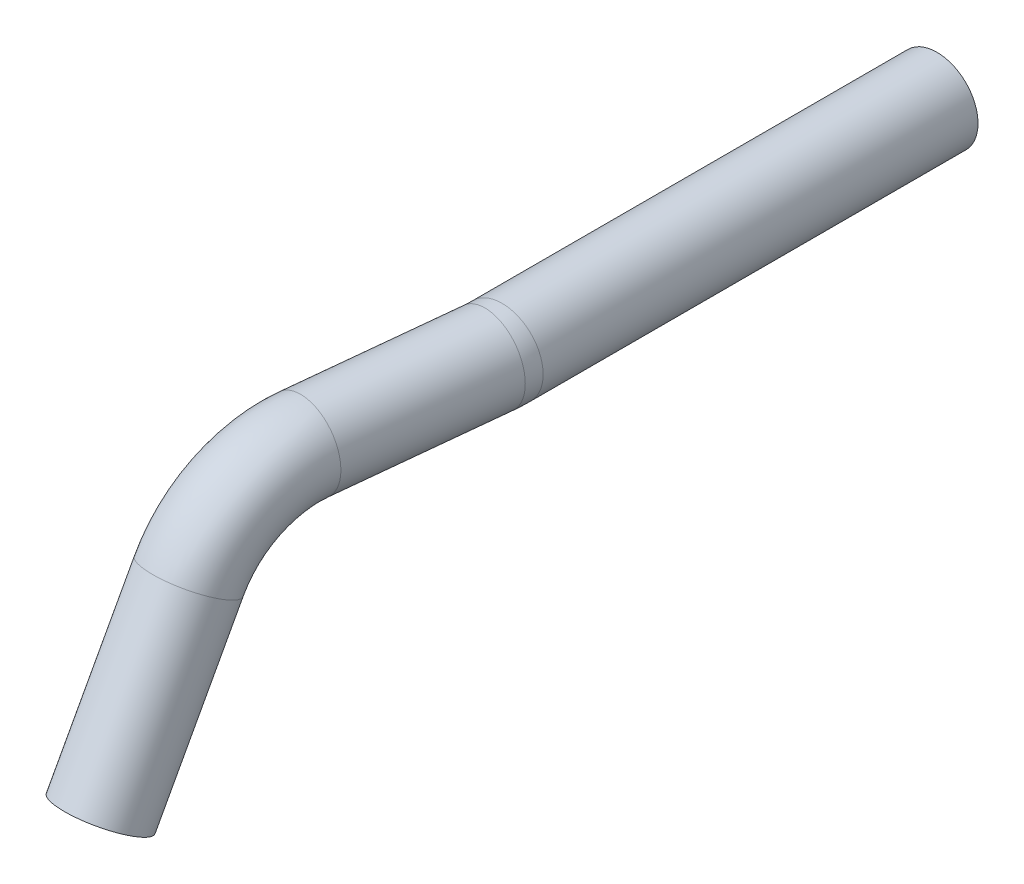
ISO-10303-21;
HEADER;
FILE_DESCRIPTION(('STEP AP214'),'2;1');
FILE_NAME('part.step','',(''),(''),'','','');
FILE_SCHEMA(('AUTOMOTIVE_DESIGN { 1 0 10303 214 1 1 1 1 }'));
ENDSEC;
DATA;
#1=APPLICATION_CONTEXT('core data for automotive mechanical design processes');
#2=APPLICATION_PROTOCOL_DEFINITION('international standard','automotive_design',2000,#1);
#3=PRODUCT_CONTEXT('',#1,'mechanical');
#4=PRODUCT('Part','Part','',(#3));
#5=PRODUCT_RELATED_PRODUCT_CATEGORY('part','',(#4));
#6=PRODUCT_DEFINITION_FORMATION('','',#4);
#7=PRODUCT_DEFINITION_CONTEXT('part definition',#1,'design');
#8=PRODUCT_DEFINITION('design','',#6,#7);
#9=PRODUCT_DEFINITION_SHAPE('','',#8);
#10=(LENGTH_UNIT() NAMED_UNIT(*) SI_UNIT(.MILLI.,.METRE.));
#11=(NAMED_UNIT(*) PLANE_ANGLE_UNIT() SI_UNIT($,.RADIAN.));
#12=(NAMED_UNIT(*) SI_UNIT($,.STERADIAN.) SOLID_ANGLE_UNIT());
#13=UNCERTAINTY_MEASURE_WITH_UNIT(LENGTH_MEASURE(1.E-05),#10,'distance_accuracy_value','');
#14=(GEOMETRIC_REPRESENTATION_CONTEXT(3) GLOBAL_UNCERTAINTY_ASSIGNED_CONTEXT((#13)) GLOBAL_UNIT_ASSIGNED_CONTEXT((#10,
#11,#12)) REPRESENTATION_CONTEXT('',''));
#15=CARTESIAN_POINT('',(0.,0.,0.));
#16=DIRECTION('',(0.,0.,1.));
#17=DIRECTION('',(1.,0.,0.));
#18=AXIS2_PLACEMENT_3D('',#15,#16,#17);
#19=CARTESIAN_POINT('',(-85.5,22.,-33.));
#20=DIRECTION('',(0.,0.,-1.));
#21=DIRECTION('',(0.,-1.,0.));
#22=AXIS2_PLACEMENT_3D('',#19,#20,#21);
#23=PLANE('',#22);
#24=CARTESIAN_POINT('',(-85.5,22.,-33.));
#25=DIRECTION('',(0.,0.,-1.));
#26=DIRECTION('',(0.0616113622510349,0.99810021543008,0.));
#27=AXIS2_PLACEMENT_3D('',#24,#25,#26);
#28=CIRCLE('',#27,4.);
#29=CARTESIAN_POINT('',(-85.2535545509959,25.9924008617203,-33.));
#30=VERTEX_POINT('',#29);
#31=EDGE_CURVE('E10',#30,#30,#28,.T.);
#32=ORIENTED_EDGE('',*,*,#31,.T.);
#33=EDGE_LOOP('',(#32));
#34=FACE_BOUND('',#33,.T.);
#35=ADVANCED_FACE('F15',(#34),#23,.T.);
#36=CARTESIAN_POINT('',(-88.,0.,46.));
#37=DIRECTION('',(0.,0.877895572914117,-0.478852130681064));
#38=DIRECTION('',(-1.,0.,0.));
#39=AXIS2_PLACEMENT_3D('',#36,#37,#38);
#40=PLANE('',#39);
#41=CARTESIAN_POINT('',(-88.,0.,46.));
#42=DIRECTION('',(0.,0.877895572914117,-0.478852130681064));
#43=DIRECTION('',(0.,0.478852130681064,0.877895572914117));
#44=AXIS2_PLACEMENT_3D('',#41,#42,#43);
#45=CIRCLE('',#44,4.);
#46=CARTESIAN_POINT('',(-88.,1.91540852272426,49.5115822916565));
#47=VERTEX_POINT('',#46);
#48=EDGE_CURVE('E37',#47,#47,#45,.T.);
#49=ORIENTED_EDGE('',*,*,#48,.F.);
#50=EDGE_LOOP('',(#49));
#51=FACE_BOUND('',#50,.T.);
#52=ADVANCED_FACE('F17',(#51),#40,.F.);
#53=CARTESIAN_POINT('',(-85.5,22.,9.376686284669));
#54=DIRECTION('',(0.,0.,-1.));
#55=DIRECTION('',(0.0616113622510349,0.99810021543008,0.));
#56=AXIS2_PLACEMENT_3D('',#53,#54,#55);
#57=CYLINDRICAL_SURFACE('',#56,4.);
#58=ORIENTED_EDGE('',*,*,#31,.F.);
#59=EDGE_LOOP('',(#58));
#60=FACE_BOUND('',#59,.T.);
#61=CARTESIAN_POINT('',(-85.5,22.,9.376686284669));
#62=DIRECTION('',(0.,0.,1.));
#63=DIRECTION('',(1.,0.,0.));
#64=AXIS2_PLACEMENT_3D('',#61,#62,#63);
#65=CIRCLE('',#64,4.);
#66=CARTESIAN_POINT('',(-81.499999999993,22.,9.376686284669));
#67=VERTEX_POINT('',#66);
#68=EDGE_CURVE('E24',#67,#67,#65,.T.);
#69=ORIENTED_EDGE('',*,*,#68,.F.);
#70=EDGE_LOOP('',(#69));
#71=FACE_BOUND('',#70,.T.);
#72=ADVANCED_FACE('F68',(#60,#71),#57,.T.);
#73=CARTESIAN_POINT('',(-97.49999999999,22.,9.376686284669));
#74=DIRECTION('',(0.,1.,0.));
#75=DIRECTION('',(0.994618408890827,0.,0.103606084258982));
#76=AXIS2_PLACEMENT_3D('',#73,#74,#75);
#77=TOROIDAL_SURFACE('',#76,11.999999999997,4.);
#78=CARTESIAN_POINT('',(-85.56457909331,22.,10.619959295782));
#79=DIRECTION('',(0.103606084258984,0.,-0.994618408890827));
#80=DIRECTION('',(0.0612797950917249,0.998100215430079,0.00638331198872051));
#81=AXIS2_PLACEMENT_3D('',#78,#79,#80);
#82=CIRCLE('',#81,4.);
#83=CARTESIAN_POINT('',(-81.5861054577406,22.,11.0343836328206));
#84=VERTEX_POINT('',#83);
#85=EDGE_CURVE('E19',#84,#84,#82,.T.);
#86=CARTESIAN_POINT('',(-97.49999999999,22.,9.376686284669));
#87=DIRECTION('',(0.,1.,0.));
#88=DIRECTION('',(0.994618408890827,0.,0.103606084258982));
#89=AXIS2_PLACEMENT_3D('',#86,#87,#88);
#90=CIRCLE('',#89,15.999999999997);
#91=EDGE_CURVE('',#84,#67,#90,.T.);
#92=ORIENTED_EDGE('',*,*,#85,.T.);
#93=ORIENTED_EDGE('',*,*,#68,.T.);
#94=ORIENTED_EDGE('',*,*,#91,.T.);
#95=ORIENTED_EDGE('',*,*,#91,.F.);
#96=EDGE_LOOP('',(#92,#94,#93,#95));
#97=FACE_BOUND('',#96,.T.);
#98=ADVANCED_FACE('F53',(#97),#77,.T.);
#99=CARTESIAN_POINT('',(-87.25948400242,22.,26.891046423247));
#100=DIRECTION('',(0.103606084258984,0.,-0.994618408890827));
#101=DIRECTION('',(0.0612797950917249,0.998100215430079,0.00638331198872051));
#102=AXIS2_PLACEMENT_3D('',#99,#100,#101);
#103=CYLINDRICAL_SURFACE('',#102,4.);
#104=ORIENTED_EDGE('',*,*,#85,.F.);
#105=EDGE_LOOP('',(#104));
#106=FACE_BOUND('',#105,.T.);
#107=CARTESIAN_POINT('',(-87.25948400242,22.,26.891046423247));
#108=DIRECTION('',(-0.103606084258983,0.,0.994618408890827));
#109=DIRECTION('',(-0.056118742468938,0.998406988410964,-0.00584570234051379));
#110=AXIS2_PLACEMENT_3D('',#107,#108,#109);
#111=CIRCLE('',#110,4.);
#112=CARTESIAN_POINT('',(-87.4839589722966,25.9936279536432,26.867663613885));
#113=VERTEX_POINT('',#112);
#114=EDGE_CURVE('E41',#113,#113,#111,.T.);
#115=ORIENTED_EDGE('',*,*,#114,.F.);
#116=EDGE_LOOP('',(#115));
#117=FACE_BOUND('',#116,.T.);
#118=ADVANCED_FACE('F55',(#106,#117),#103,.T.);
#119=CARTESIAN_POINT('',(-86.58605909279,10.019116139068,26.961194851333));
#120=DIRECTION('',(-0.993033970238722,-0.0564223846725643,-0.103441038566824));
#121=DIRECTION('',(-0.117828408934018,0.475516432487071,0.87178012622613));
#122=AXIS2_PLACEMENT_3D('',#119,#120,#121);
#123=TOROIDAL_SURFACE('',#122,12.,4.);
#124=CARTESIAN_POINT('',(-88.,15.725313328913,37.422556366048));
#125=DIRECTION('',(0.,0.877895572914117,-0.478852130681064));
#126=DIRECTION('',(0.,0.478852130681064,0.877895572914117));
#127=AXIS2_PLACEMENT_3D('',#124,#125,#126);
#128=CIRCLE('',#127,4.);
#129=CARTESIAN_POINT('',(-88.4713136357364,17.6273790588604,40.9096768709512));
#130=VERTEX_POINT('',#129);
#131=EDGE_CURVE('E35',#130,#130,#128,.T.);
#132=CARTESIAN_POINT('',(-86.58605909279,10.019116139068,26.961194851333));
#133=DIRECTION('',(-0.993033970238722,-0.0564223846725643,-0.103441038566824));
#134=DIRECTION('',(-0.117828408934018,0.475516432487071,0.87178012622613));
#135=AXIS2_PLACEMENT_3D('',#132,#133,#134);
#136=CIRCLE('',#135,16.);
#137=EDGE_CURVE('',#130,#113,#136,.T.);
#138=ORIENTED_EDGE('',*,*,#131,.T.);
#139=ORIENTED_EDGE('',*,*,#114,.T.);
#140=ORIENTED_EDGE('',*,*,#137,.T.);
#141=ORIENTED_EDGE('',*,*,#137,.F.);
#142=EDGE_LOOP('',(#138,#140,#139,#141));
#143=FACE_BOUND('',#142,.T.);
#144=ADVANCED_FACE('F58',(#143),#123,.T.);
#145=CARTESIAN_POINT('',(-88.,0.,46.));
#146=DIRECTION('',(0.,0.877895572914117,-0.478852130681064));
#147=DIRECTION('',(0.,0.478852130681064,0.877895572914117));
#148=AXIS2_PLACEMENT_3D('',#145,#146,#147);
#149=CYLINDRICAL_SURFACE('',#148,4.);
#150=ORIENTED_EDGE('',*,*,#131,.F.);
#151=EDGE_LOOP('',(#150));
#152=FACE_BOUND('',#151,.T.);
#153=ORIENTED_EDGE('',*,*,#48,.T.);
#154=EDGE_LOOP('',(#153));
#155=FACE_BOUND('',#154,.T.);
#156=ADVANCED_FACE('F66',(#152,#155),#149,.T.);
#157=CLOSED_SHELL('',(#35,#52,#72,#98,#118,#144,#156));
#158=MANIFOLD_SOLID_BREP('B1',#157);
#159=ADVANCED_BREP_SHAPE_REPRESENTATION('',(#18,#158),#14);
#160=SHAPE_DEFINITION_REPRESENTATION(#9,#159);
ENDSEC;
END-ISO-10303-21;
